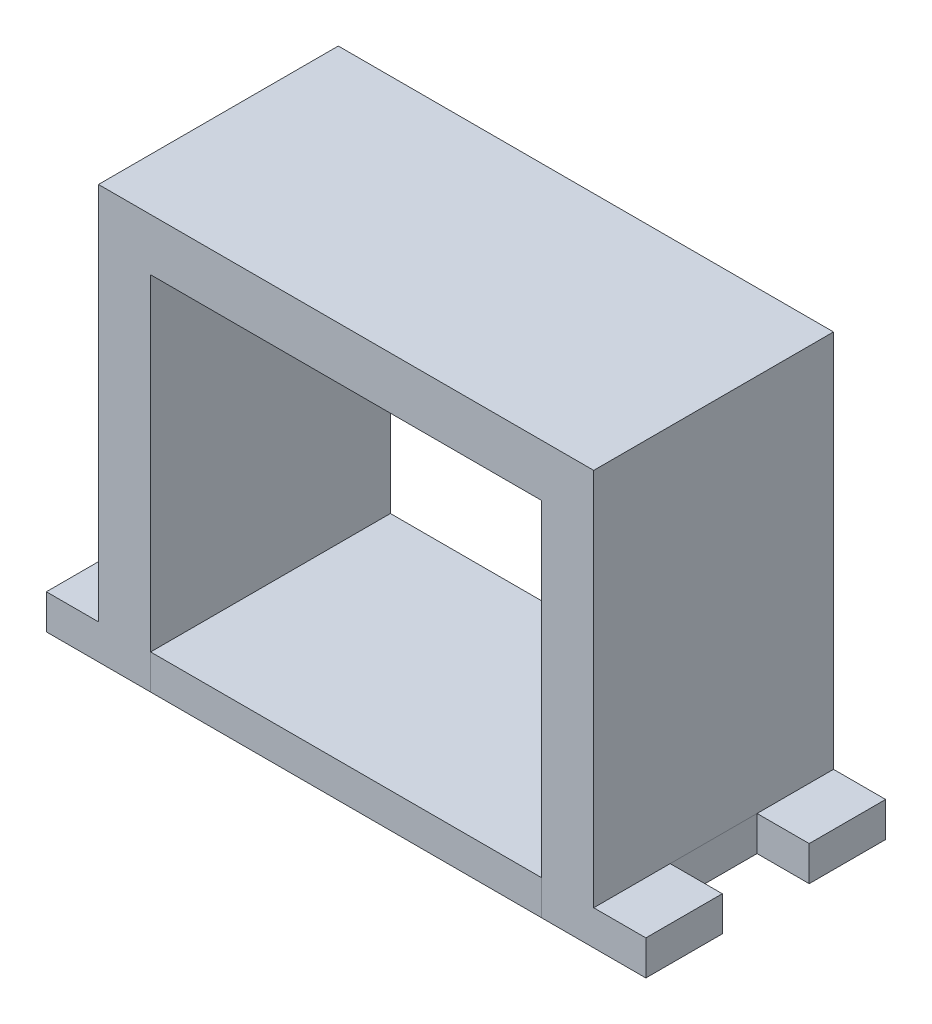
ISO-10303-21;
HEADER;
FILE_DESCRIPTION(('STEP AP214'),'2;1');
FILE_NAME('part.step','',(''),(''),'','','');
FILE_SCHEMA(('AUTOMOTIVE_DESIGN { 1 0 10303 214 1 1 1 1 }'));
ENDSEC;
DATA;
#1=APPLICATION_CONTEXT('core data for automotive mechanical design processes');
#2=APPLICATION_PROTOCOL_DEFINITION('international standard','automotive_design',2000,#1);
#3=PRODUCT_CONTEXT('',#1,'mechanical');
#4=PRODUCT('Part','Part','',(#3));
#5=PRODUCT_RELATED_PRODUCT_CATEGORY('part','',(#4));
#6=PRODUCT_DEFINITION_FORMATION('','',#4);
#7=PRODUCT_DEFINITION_CONTEXT('part definition',#1,'design');
#8=PRODUCT_DEFINITION('design','',#6,#7);
#9=PRODUCT_DEFINITION_SHAPE('','',#8);
#10=(LENGTH_UNIT() NAMED_UNIT(*) SI_UNIT(.MILLI.,.METRE.));
#11=(NAMED_UNIT(*) PLANE_ANGLE_UNIT() SI_UNIT($,.RADIAN.));
#12=(NAMED_UNIT(*) SI_UNIT($,.STERADIAN.) SOLID_ANGLE_UNIT());
#13=UNCERTAINTY_MEASURE_WITH_UNIT(LENGTH_MEASURE(1.E-05),#10,'distance_accuracy_value','');
#14=(GEOMETRIC_REPRESENTATION_CONTEXT(3) GLOBAL_UNCERTAINTY_ASSIGNED_CONTEXT((#13)) GLOBAL_UNIT_ASSIGNED_CONTEXT((#10,
#11,#12)) REPRESENTATION_CONTEXT('',''));
#15=CARTESIAN_POINT('',(0.,0.,0.));
#16=DIRECTION('',(0.,0.,1.));
#17=DIRECTION('',(1.,0.,0.));
#18=AXIS2_PLACEMENT_3D('',#15,#16,#17);
#19=CARTESIAN_POINT('',(0.,-20.8,2.5));
#20=DIRECTION('',(0.,0.,1.));
#21=DIRECTION('',(1.,0.,0.));
#22=AXIS2_PLACEMENT_3D('',#19,#20,#21);
#23=PLANE('',#22);
#24=DIRECTION('',(1.,0.,0.));
#25=VECTOR('',#24,1.);
#26=CARTESIAN_POINT('',(0.,-18.8,2.5));
#27=LINE('',#26,#25);
#28=CARTESIAN_POINT('',(-14.25,-18.8,2.5));
#29=VERTEX_POINT('',#28);
#30=CARTESIAN_POINT('',(-11.25,-18.8,2.5));
#31=VERTEX_POINT('',#30);
#32=EDGE_CURVE('E171',#29,#31,#27,.T.);
#33=ORIENTED_EDGE('',*,*,#32,.F.);
#34=DIRECTION('',(0.,1.,0.));
#35=VECTOR('',#34,1.);
#36=CARTESIAN_POINT('',(-14.25,-20.8,2.5));
#37=LINE('',#36,#35);
#38=CARTESIAN_POINT('',(-14.25,-20.8,2.5));
#39=VERTEX_POINT('',#38);
#40=EDGE_CURVE('E12',#39,#29,#37,.T.);
#41=ORIENTED_EDGE('',*,*,#40,.F.);
#42=DIRECTION('',(1.,0.,0.));
#43=VECTOR('',#42,1.);
#44=CARTESIAN_POINT('',(0.,-20.8,2.5));
#45=LINE('',#44,#43);
#46=CARTESIAN_POINT('',(-11.25,-20.8,2.5));
#47=VERTEX_POINT('',#46);
#48=EDGE_CURVE('E254',#39,#47,#45,.T.);
#49=ORIENTED_EDGE('',*,*,#48,.T.);
#50=DIRECTION('',(0.,1.,0.));
#51=VECTOR('',#50,1.);
#52=CARTESIAN_POINT('',(-11.25,-20.8,2.5));
#53=LINE('',#52,#51);
#54=EDGE_CURVE('E67',#47,#31,#53,.T.);
#55=ORIENTED_EDGE('',*,*,#54,.T.);
#56=EDGE_LOOP('',(#33,#41,#49,#55));
#57=FACE_BOUND('',#56,.T.);
#58=ADVANCED_FACE('F51',(#57),#23,.T.);
#59=CARTESIAN_POINT('',(-14.25,-20.8,0.));
#60=DIRECTION('',(1.,0.,0.));
#61=DIRECTION('',(0.,0.,-1.));
#62=AXIS2_PLACEMENT_3D('',#59,#60,#61);
#63=PLANE('',#62);
#64=DIRECTION('',(0.,0.,-1.));
#65=VECTOR('',#64,1.);
#66=CARTESIAN_POINT('',(-14.25,-18.8,0.));
#67=LINE('',#66,#65);
#68=CARTESIAN_POINT('',(-14.25,-18.8,-2.5));
#69=VERTEX_POINT('',#68);
#70=EDGE_CURVE('E173',#29,#69,#67,.T.);
#71=ORIENTED_EDGE('',*,*,#70,.T.);
#72=DIRECTION('',(0.,1.,0.));
#73=VECTOR('',#72,1.);
#74=CARTESIAN_POINT('',(-14.25,-20.8,-2.5));
#75=LINE('',#74,#73);
#76=CARTESIAN_POINT('',(-14.25,-20.8,-2.5));
#77=VERTEX_POINT('',#76);
#78=EDGE_CURVE('E59',#77,#69,#75,.T.);
#79=ORIENTED_EDGE('',*,*,#78,.F.);
#80=DIRECTION('',(0.,0.,-1.));
#81=VECTOR('',#80,1.);
#82=CARTESIAN_POINT('',(-14.25,-20.8,0.));
#83=LINE('',#82,#81);
#84=EDGE_CURVE('E235',#39,#77,#83,.T.);
#85=ORIENTED_EDGE('',*,*,#84,.F.);
#86=ORIENTED_EDGE('',*,*,#40,.T.);
#87=EDGE_LOOP('',(#71,#79,#85,#86));
#88=FACE_BOUND('',#87,.T.);
#89=ADVANCED_FACE('F256',(#88),#63,.F.);
#90=CARTESIAN_POINT('',(0.,-20.8,-2.5));
#91=DIRECTION('',(0.,0.,1.));
#92=DIRECTION('',(1.,0.,0.));
#93=AXIS2_PLACEMENT_3D('',#90,#91,#92);
#94=PLANE('',#93);
#95=DIRECTION('',(1.,0.,0.));
#96=VECTOR('',#95,1.);
#97=CARTESIAN_POINT('',(0.,-18.8,-2.5));
#98=LINE('',#97,#96);
#99=CARTESIAN_POINT('',(-11.25,-18.8,-2.5));
#100=VERTEX_POINT('',#99);
#101=EDGE_CURVE('E175',#69,#100,#98,.T.);
#102=ORIENTED_EDGE('',*,*,#101,.T.);
#103=DIRECTION('',(0.,1.,0.));
#104=VECTOR('',#103,1.);
#105=CARTESIAN_POINT('',(-11.25,-20.8,-2.5));
#106=LINE('',#105,#104);
#107=CARTESIAN_POINT('',(-11.25,-20.8,-2.5));
#108=VERTEX_POINT('',#107);
#109=EDGE_CURVE('E212',#108,#100,#106,.T.);
#110=ORIENTED_EDGE('',*,*,#109,.F.);
#111=DIRECTION('',(1.,0.,0.));
#112=VECTOR('',#111,1.);
#113=CARTESIAN_POINT('',(0.,-20.8,-2.5));
#114=LINE('',#113,#112);
#115=EDGE_CURVE('E220',#77,#108,#114,.T.);
#116=ORIENTED_EDGE('',*,*,#115,.F.);
#117=ORIENTED_EDGE('',*,*,#78,.T.);
#118=EDGE_LOOP('',(#102,#110,#116,#117));
#119=FACE_BOUND('',#118,.T.);
#120=ADVANCED_FACE('F218',(#119),#94,.F.);
#121=CARTESIAN_POINT('',(-11.25,-20.8,0.));
#122=DIRECTION('',(-1.,0.,0.));
#123=DIRECTION('',(0.,0.,1.));
#124=AXIS2_PLACEMENT_3D('',#121,#122,#123);
#125=PLANE('',#124);
#126=DIRECTION('',(0.,0.,1.));
#127=VECTOR('',#126,1.);
#128=CARTESIAN_POINT('',(-11.25,-18.8,0.));
#129=LINE('',#128,#127);
#130=CARTESIAN_POINT('',(-11.25,-18.8,-6.9));
#131=VERTEX_POINT('',#130);
#132=EDGE_CURVE('E178',#131,#100,#129,.T.);
#133=ORIENTED_EDGE('',*,*,#132,.F.);
#134=DIRECTION('',(0.,1.,0.));
#135=VECTOR('',#134,1.);
#136=CARTESIAN_POINT('',(-11.25,-20.8,-6.9));
#137=LINE('',#136,#135);
#138=CARTESIAN_POINT('',(-11.25,-20.8,-6.9));
#139=VERTEX_POINT('',#138);
#140=EDGE_CURVE('E210',#139,#131,#137,.T.);
#141=ORIENTED_EDGE('',*,*,#140,.F.);
#142=DIRECTION('',(0.,0.,1.));
#143=VECTOR('',#142,1.);
#144=CARTESIAN_POINT('',(-11.25,-20.8,0.));
#145=LINE('',#144,#143);
#146=EDGE_CURVE('E167',#139,#108,#145,.T.);
#147=ORIENTED_EDGE('',*,*,#146,.T.);
#148=ORIENTED_EDGE('',*,*,#109,.T.);
#149=EDGE_LOOP('',(#133,#141,#147,#148));
#150=FACE_BOUND('',#149,.T.);
#151=ADVANCED_FACE('F228',(#150),#125,.T.);
#152=CARTESIAN_POINT('',(0.,-20.8,-6.9));
#153=DIRECTION('',(0.,0.,-1.));
#154=DIRECTION('',(-1.,0.,0.));
#155=AXIS2_PLACEMENT_3D('',#152,#153,#154);
#156=PLANE('',#155);
#157=DIRECTION('',(-1.,0.,0.));
#158=VECTOR('',#157,1.);
#159=CARTESIAN_POINT('',(0.,-18.8,-6.9));
#160=LINE('',#159,#158);
#161=CARTESIAN_POINT('',(11.25,-18.8,-6.9));
#162=VERTEX_POINT('',#161);
#163=EDGE_CURVE('E181',#162,#131,#160,.T.);
#164=ORIENTED_EDGE('',*,*,#163,.F.);
#165=DIRECTION('',(0.,1.,0.));
#166=VECTOR('',#165,1.);
#167=CARTESIAN_POINT('',(11.25,-20.8,-6.9));
#168=LINE('',#167,#166);
#169=CARTESIAN_POINT('',(11.25,-20.8,-6.9));
#170=VERTEX_POINT('',#169);
#171=EDGE_CURVE('E208',#170,#162,#168,.T.);
#172=ORIENTED_EDGE('',*,*,#171,.F.);
#173=DIRECTION('',(-1.,0.,0.));
#174=VECTOR('',#173,1.);
#175=CARTESIAN_POINT('',(0.,-20.8,-6.9));
#176=LINE('',#175,#174);
#177=EDGE_CURVE('E233',#170,#139,#176,.T.);
#178=ORIENTED_EDGE('',*,*,#177,.T.);
#179=ORIENTED_EDGE('',*,*,#140,.T.);
#180=EDGE_LOOP('',(#164,#172,#178,#179));
#181=FACE_BOUND('',#180,.T.);
#182=ADVANCED_FACE('F264',(#181),#156,.T.);
#183=CARTESIAN_POINT('',(11.25,-20.8,0.));
#184=DIRECTION('',(1.,0.,0.));
#185=DIRECTION('',(0.,0.,-1.));
#186=AXIS2_PLACEMENT_3D('',#183,#184,#185);
#187=PLANE('',#186);
#188=DIRECTION('',(0.,0.,-1.));
#189=VECTOR('',#188,1.);
#190=CARTESIAN_POINT('',(11.25,-18.8,0.));
#191=LINE('',#190,#189);
#192=CARTESIAN_POINT('',(11.25,-18.8,-2.49999999999999));
#193=VERTEX_POINT('',#192);
#194=EDGE_CURVE('E185',#193,#162,#191,.T.);
#195=ORIENTED_EDGE('',*,*,#194,.F.);
#196=DIRECTION('',(0.,1.,0.));
#197=VECTOR('',#196,1.);
#198=CARTESIAN_POINT('',(11.25,-20.8,-2.49999999999999));
#199=LINE('',#198,#197);
#200=CARTESIAN_POINT('',(11.25,-20.8,-2.49999999999999));
#201=VERTEX_POINT('',#200);
#202=EDGE_CURVE('E206',#201,#193,#199,.T.);
#203=ORIENTED_EDGE('',*,*,#202,.F.);
#204=DIRECTION('',(0.,0.,-1.));
#205=VECTOR('',#204,1.);
#206=CARTESIAN_POINT('',(11.25,-20.8,0.));
#207=LINE('',#206,#205);
#208=EDGE_CURVE('E162',#201,#170,#207,.T.);
#209=ORIENTED_EDGE('',*,*,#208,.T.);
#210=ORIENTED_EDGE('',*,*,#171,.T.);
#211=EDGE_LOOP('',(#195,#203,#209,#210));
#212=FACE_BOUND('',#211,.T.);
#213=ADVANCED_FACE('F267',(#212),#187,.T.);
#214=CARTESIAN_POINT('',(0.,-20.8,-2.49999999999999));
#215=DIRECTION('',(0.,0.,-1.));
#216=DIRECTION('',(-1.,0.,0.));
#217=AXIS2_PLACEMENT_3D('',#214,#215,#216);
#218=PLANE('',#217);
#219=DIRECTION('',(-1.,0.,0.));
#220=VECTOR('',#219,1.);
#221=CARTESIAN_POINT('',(0.,-18.8,-2.49999999999999));
#222=LINE('',#221,#220);
#223=CARTESIAN_POINT('',(14.25,-18.8,-2.49999999999999));
#224=VERTEX_POINT('',#223);
#225=EDGE_CURVE('E188',#224,#193,#222,.T.);
#226=ORIENTED_EDGE('',*,*,#225,.F.);
#227=DIRECTION('',(0.,1.,0.));
#228=VECTOR('',#227,1.);
#229=CARTESIAN_POINT('',(14.25,-20.8,-2.49999999999999));
#230=LINE('',#229,#228);
#231=CARTESIAN_POINT('',(14.25,-20.8,-2.49999999999999));
#232=VERTEX_POINT('',#231);
#233=EDGE_CURVE('E204',#232,#224,#230,.T.);
#234=ORIENTED_EDGE('',*,*,#233,.F.);
#235=DIRECTION('',(-1.,0.,0.));
#236=VECTOR('',#235,1.);
#237=CARTESIAN_POINT('',(0.,-20.8,-2.49999999999999));
#238=LINE('',#237,#236);
#239=EDGE_CURVE('E240',#232,#201,#238,.T.);
#240=ORIENTED_EDGE('',*,*,#239,.T.);
#241=ORIENTED_EDGE('',*,*,#202,.T.);
#242=EDGE_LOOP('',(#226,#234,#240,#241));
#243=FACE_BOUND('',#242,.T.);
#244=ADVANCED_FACE('F269',(#243),#218,.T.);
#245=CARTESIAN_POINT('',(14.25,-20.8,0.));
#246=DIRECTION('',(-1.,0.,0.));
#247=DIRECTION('',(0.,0.,1.));
#248=AXIS2_PLACEMENT_3D('',#245,#246,#247);
#249=PLANE('',#248);
#250=DIRECTION('',(0.,0.,1.));
#251=VECTOR('',#250,1.);
#252=CARTESIAN_POINT('',(14.25,-18.8,0.));
#253=LINE('',#252,#251);
#254=CARTESIAN_POINT('',(14.25,-18.8,2.5));
#255=VERTEX_POINT('',#254);
#256=EDGE_CURVE('E191',#224,#255,#253,.T.);
#257=ORIENTED_EDGE('',*,*,#256,.T.);
#258=DIRECTION('',(0.,1.,0.));
#259=VECTOR('',#258,1.);
#260=CARTESIAN_POINT('',(14.25,-20.8,2.5));
#261=LINE('',#260,#259);
#262=CARTESIAN_POINT('',(14.25,-20.8,2.5));
#263=VERTEX_POINT('',#262);
#264=EDGE_CURVE('E201',#263,#255,#261,.T.);
#265=ORIENTED_EDGE('',*,*,#264,.F.);
#266=DIRECTION('',(0.,0.,1.));
#267=VECTOR('',#266,1.);
#268=CARTESIAN_POINT('',(14.25,-20.8,0.));
#269=LINE('',#268,#267);
#270=EDGE_CURVE('E242',#232,#263,#269,.T.);
#271=ORIENTED_EDGE('',*,*,#270,.F.);
#272=ORIENTED_EDGE('',*,*,#233,.T.);
#273=EDGE_LOOP('',(#257,#265,#271,#272));
#274=FACE_BOUND('',#273,.T.);
#275=ADVANCED_FACE('F248',(#274),#249,.F.);
#276=CARTESIAN_POINT('',(0.,-20.8,2.5));
#277=DIRECTION('',(0.,0.,-1.));
#278=DIRECTION('',(-1.,0.,0.));
#279=AXIS2_PLACEMENT_3D('',#276,#277,#278);
#280=PLANE('',#279);
#281=DIRECTION('',(-1.,0.,0.));
#282=VECTOR('',#281,1.);
#283=CARTESIAN_POINT('',(0.,-18.8,2.5));
#284=LINE('',#283,#282);
#285=CARTESIAN_POINT('',(11.25,-18.8,2.5));
#286=VERTEX_POINT('',#285);
#287=EDGE_CURVE('E193',#255,#286,#284,.T.);
#288=ORIENTED_EDGE('',*,*,#287,.T.);
#289=DIRECTION('',(0.,1.,0.));
#290=VECTOR('',#289,1.);
#291=CARTESIAN_POINT('',(11.25,-20.8,2.5));
#292=LINE('',#291,#290);
#293=CARTESIAN_POINT('',(11.25,-20.8,2.5));
#294=VERTEX_POINT('',#293);
#295=EDGE_CURVE('E150',#294,#286,#292,.T.);
#296=ORIENTED_EDGE('',*,*,#295,.F.);
#297=DIRECTION('',(-1.,0.,0.));
#298=VECTOR('',#297,1.);
#299=CARTESIAN_POINT('',(0.,-20.8,2.5));
#300=LINE('',#299,#298);
#301=EDGE_CURVE('E159',#263,#294,#300,.T.);
#302=ORIENTED_EDGE('',*,*,#301,.F.);
#303=ORIENTED_EDGE('',*,*,#264,.T.);
#304=EDGE_LOOP('',(#288,#296,#302,#303));
#305=FACE_BOUND('',#304,.T.);
#306=ADVANCED_FACE('F252',(#305),#280,.F.);
#307=CARTESIAN_POINT('',(11.25,-18.8,6.9));
#308=VERTEX_POINT('',#307);
#309=EDGE_CURVE('E146',#308,#286,#191,.T.);
#310=ORIENTED_EDGE('',*,*,#309,.F.);
#311=DIRECTION('',(0.,1.,0.));
#312=VECTOR('',#311,1.);
#313=CARTESIAN_POINT('',(11.25,-20.8,6.9));
#314=LINE('',#313,#312);
#315=CARTESIAN_POINT('',(11.25,-20.8,6.9));
#316=VERTEX_POINT('',#315);
#317=EDGE_CURVE('E141',#316,#308,#314,.T.);
#318=ORIENTED_EDGE('',*,*,#317,.F.);
#319=EDGE_CURVE('E144',#316,#294,#207,.T.);
#320=ORIENTED_EDGE('',*,*,#319,.T.);
#321=ORIENTED_EDGE('',*,*,#295,.T.);
#322=EDGE_LOOP('',(#310,#318,#320,#321));
#323=FACE_BOUND('',#322,.T.);
#324=ADVANCED_FACE('F143',(#323),#187,.T.);
#325=CARTESIAN_POINT('',(0.,-20.8,6.9));
#326=DIRECTION('',(0.,0.,1.));
#327=DIRECTION('',(1.,0.,0.));
#328=AXIS2_PLACEMENT_3D('',#325,#326,#327);
#329=PLANE('',#328);
#330=DIRECTION('',(1.,0.,0.));
#331=VECTOR('',#330,1.);
#332=CARTESIAN_POINT('',(0.,-18.8,6.9));
#333=LINE('',#332,#331);
#334=CARTESIAN_POINT('',(-11.25,-18.8,6.9));
#335=VERTEX_POINT('',#334);
#336=EDGE_CURVE('E196',#335,#308,#333,.T.);
#337=ORIENTED_EDGE('',*,*,#336,.F.);
#338=DIRECTION('',(0.,1.,0.));
#339=VECTOR('',#338,1.);
#340=CARTESIAN_POINT('',(-11.25,-20.8,6.9));
#341=LINE('',#340,#339);
#342=CARTESIAN_POINT('',(-11.25,-20.8,6.9));
#343=VERTEX_POINT('',#342);
#344=EDGE_CURVE('E104',#343,#335,#341,.T.);
#345=ORIENTED_EDGE('',*,*,#344,.F.);
#346=DIRECTION('',(1.,0.,0.));
#347=VECTOR('',#346,1.);
#348=CARTESIAN_POINT('',(0.,-20.8,6.9));
#349=LINE('',#348,#347);
#350=EDGE_CURVE('E157',#343,#316,#349,.T.);
#351=ORIENTED_EDGE('',*,*,#350,.T.);
#352=ORIENTED_EDGE('',*,*,#317,.T.);
#353=EDGE_LOOP('',(#337,#345,#351,#352));
#354=FACE_BOUND('',#353,.T.);
#355=ADVANCED_FACE('F163',(#354),#329,.T.);
#356=EDGE_CURVE('E182',#31,#335,#129,.T.);
#357=ORIENTED_EDGE('',*,*,#356,.F.);
#358=ORIENTED_EDGE('',*,*,#54,.F.);
#359=EDGE_CURVE('E164',#47,#343,#145,.T.);
#360=ORIENTED_EDGE('',*,*,#359,.T.);
#361=ORIENTED_EDGE('',*,*,#344,.T.);
#362=EDGE_LOOP('',(#357,#358,#360,#361));
#363=FACE_BOUND('',#362,.T.);
#364=ADVANCED_FACE('F281',(#363),#125,.T.);
#365=CARTESIAN_POINT('',(0.,-20.8,0.));
#366=DIRECTION('',(0.,-1.,0.));
#367=DIRECTION('',(0.,0.,-1.));
#368=AXIS2_PLACEMENT_3D('',#365,#366,#367);
#369=PLANE('',#368);
#370=ORIENTED_EDGE('',*,*,#48,.F.);
#371=ORIENTED_EDGE('',*,*,#84,.T.);
#372=ORIENTED_EDGE('',*,*,#115,.T.);
#373=ORIENTED_EDGE('',*,*,#146,.F.);
#374=ORIENTED_EDGE('',*,*,#177,.F.);
#375=ORIENTED_EDGE('',*,*,#208,.F.);
#376=ORIENTED_EDGE('',*,*,#239,.F.);
#377=ORIENTED_EDGE('',*,*,#270,.T.);
#378=ORIENTED_EDGE('',*,*,#301,.T.);
#379=ORIENTED_EDGE('',*,*,#319,.F.);
#380=ORIENTED_EDGE('',*,*,#350,.F.);
#381=ORIENTED_EDGE('',*,*,#359,.F.);
#382=EDGE_LOOP('',(#370,#371,#372,#373,#374,#375,#376,#377,#378,#379,#380,#381));
#383=FACE_BOUND('',#382,.T.);
#384=ADVANCED_FACE('F155',(#383),#369,.T.);
#385=CARTESIAN_POINT('',(0.,-18.8,0.));
#386=DIRECTION('',(0.,-1.,0.));
#387=DIRECTION('',(0.,0.,-1.));
#388=AXIS2_PLACEMENT_3D('',#385,#386,#387);
#389=PLANE('',#388);
#390=ORIENTED_EDGE('',*,*,#32,.T.);
#391=ORIENTED_EDGE('',*,*,#356,.T.);
#392=ORIENTED_EDGE('',*,*,#336,.T.);
#393=ORIENTED_EDGE('',*,*,#309,.T.);
#394=ORIENTED_EDGE('',*,*,#287,.F.);
#395=ORIENTED_EDGE('',*,*,#256,.F.);
#396=ORIENTED_EDGE('',*,*,#225,.T.);
#397=ORIENTED_EDGE('',*,*,#194,.T.);
#398=ORIENTED_EDGE('',*,*,#163,.T.);
#399=ORIENTED_EDGE('',*,*,#132,.T.);
#400=ORIENTED_EDGE('',*,*,#101,.F.);
#401=ORIENTED_EDGE('',*,*,#70,.F.);
#402=EDGE_LOOP('',(#390,#391,#392,#393,#394,#395,#396,#397,#398,#399,#400,#401));
#403=FACE_BOUND('',#402,.T.);
#404=ADVANCED_FACE('F224',(#403),#389,.F.);
#405=CLOSED_SHELL('',(#58,#89,#120,#151,#182,#213,#244,#275,#306,#324,#355,#364,#384,#404));
#406=MANIFOLD_SOLID_BREP('B2',#405);
#407=CARTESIAN_POINT('',(14.25,3.,0.));
#408=DIRECTION('',(-1.,0.,0.));
#409=DIRECTION('',(0.,0.,1.));
#410=AXIS2_PLACEMENT_3D('',#407,#408,#409);
#411=PLANE('',#410);
#412=DIRECTION('',(0.,0.,-1.));
#413=VECTOR('',#412,1.);
#414=CARTESIAN_POINT('',(14.25,-18.8,0.));
#415=LINE('',#414,#413);
#416=CARTESIAN_POINT('',(14.25,-18.8,-2.49999999999999));
#417=VERTEX_POINT('',#416);
#418=CARTESIAN_POINT('',(14.25,-18.8,-6.9));
#419=VERTEX_POINT('',#418);
#420=EDGE_CURVE('E440',#417,#419,#415,.T.);
#421=ORIENTED_EDGE('',*,*,#420,.T.);
#422=DIRECTION('',(0.,-1.,0.));
#423=VECTOR('',#422,1.);
#424=CARTESIAN_POINT('',(14.25,3.,-6.9));
#425=LINE('',#424,#423);
#426=CARTESIAN_POINT('',(14.25,3.,-6.9));
#427=VERTEX_POINT('',#426);
#428=EDGE_CURVE('E753',#427,#419,#425,.T.);
#429=ORIENTED_EDGE('',*,*,#428,.F.);
#430=DIRECTION('',(0.,0.,-1.));
#431=VECTOR('',#430,1.);
#432=CARTESIAN_POINT('',(14.25,3.,0.));
#433=LINE('',#432,#431);
#434=CARTESIAN_POINT('',(14.25,3.,6.9));
#435=VERTEX_POINT('',#434);
#436=EDGE_CURVE('E751',#435,#427,#433,.T.);
#437=ORIENTED_EDGE('',*,*,#436,.F.);
#438=DIRECTION('',(0.,-1.,0.));
#439=VECTOR('',#438,1.);
#440=CARTESIAN_POINT('',(14.25,3.,6.9));
#441=LINE('',#440,#439);
#442=CARTESIAN_POINT('',(14.25,-18.8,6.9));
#443=VERTEX_POINT('',#442);
#444=EDGE_CURVE('E759',#435,#443,#441,.T.);
#445=ORIENTED_EDGE('',*,*,#444,.T.);
#446=DIRECTION('',(0.,0.,-1.));
#447=VECTOR('',#446,1.);
#448=CARTESIAN_POINT('',(14.25,-18.8,0.));
#449=LINE('',#448,#447);
#450=CARTESIAN_POINT('',(14.25,-18.8,2.5));
#451=VERTEX_POINT('',#450);
#452=EDGE_CURVE('E595',#443,#451,#449,.T.);
#453=ORIENTED_EDGE('',*,*,#452,.T.);
#454=DIRECTION('',(0.,0.,-1.));
#455=VECTOR('',#454,1.);
#456=CARTESIAN_POINT('',(14.25,-18.8,0.));
#457=LINE('',#456,#455);
#458=EDGE_CURVE('E713',#451,#417,#457,.T.);
#459=ORIENTED_EDGE('',*,*,#458,.T.);
#460=EDGE_LOOP('',(#421,#429,#437,#445,#453,#459));
#461=FACE_BOUND('',#460,.T.);
#462=ADVANCED_FACE('F425',(#461),#411,.F.);
#463=CARTESIAN_POINT('',(-14.25,3.,0.));
#464=DIRECTION('',(-1.,0.,0.));
#465=DIRECTION('',(0.,0.,1.));
#466=AXIS2_PLACEMENT_3D('',#463,#464,#465);
#467=PLANE('',#466);
#468=DIRECTION('',(0.,-1.,0.));
#469=VECTOR('',#468,1.);
#470=CARTESIAN_POINT('',(-14.25,3.,-6.9));
#471=LINE('',#470,#469);
#472=CARTESIAN_POINT('',(-14.25,3.,-6.9));
#473=VERTEX_POINT('',#472);
#474=CARTESIAN_POINT('',(-14.25,-18.8,-6.9));
#475=VERTEX_POINT('',#474);
#476=EDGE_CURVE('E49',#473,#475,#471,.T.);
#477=ORIENTED_EDGE('',*,*,#476,.T.);
#478=DIRECTION('',(0.,0.,-1.));
#479=VECTOR('',#478,1.);
#480=CARTESIAN_POINT('',(-14.25,-18.8,0.));
#481=LINE('',#480,#479);
#482=CARTESIAN_POINT('',(-14.25,-18.8,-2.5));
#483=VERTEX_POINT('',#482);
#484=EDGE_CURVE('E628',#483,#475,#481,.T.);
#485=ORIENTED_EDGE('',*,*,#484,.F.);
#486=DIRECTION('',(0.,0.,-1.));
#487=VECTOR('',#486,1.);
#488=CARTESIAN_POINT('',(-14.25,-18.8,0.));
#489=LINE('',#488,#487);
#490=CARTESIAN_POINT('',(-14.25,-18.8,2.5));
#491=VERTEX_POINT('',#490);
#492=EDGE_CURVE('E724',#491,#483,#489,.T.);
#493=ORIENTED_EDGE('',*,*,#492,.F.);
#494=DIRECTION('',(0.,0.,-1.));
#495=VECTOR('',#494,1.);
#496=CARTESIAN_POINT('',(-14.25,-18.8,0.));
#497=LINE('',#496,#495);
#498=CARTESIAN_POINT('',(-14.25,-18.8,6.9));
#499=VERTEX_POINT('',#498);
#500=EDGE_CURVE('E448',#499,#491,#497,.T.);
#501=ORIENTED_EDGE('',*,*,#500,.F.);
#502=DIRECTION('',(0.,-1.,0.));
#503=VECTOR('',#502,1.);
#504=CARTESIAN_POINT('',(-14.25,3.,6.9));
#505=LINE('',#504,#503);
#506=CARTESIAN_POINT('',(-14.25,3.,6.9));
#507=VERTEX_POINT('',#506);
#508=EDGE_CURVE('E433',#507,#499,#505,.T.);
#509=ORIENTED_EDGE('',*,*,#508,.F.);
#510=DIRECTION('',(0.,0.,-1.));
#511=VECTOR('',#510,1.);
#512=CARTESIAN_POINT('',(-14.25,3.,0.));
#513=LINE('',#512,#511);
#514=EDGE_CURVE('E745',#507,#473,#513,.T.);
#515=ORIENTED_EDGE('',*,*,#514,.T.);
#516=EDGE_LOOP('',(#477,#485,#493,#501,#509,#515));
#517=FACE_BOUND('',#516,.T.);
#518=ADVANCED_FACE('F807',(#517),#467,.T.);
#519=CARTESIAN_POINT('',(0.,-18.8,0.));
#520=DIRECTION('',(0.,1.,0.));
#521=DIRECTION('',(0.,0.,1.));
#522=AXIS2_PLACEMENT_3D('',#519,#520,#521);
#523=PLANE('',#522);
#524=DIRECTION('',(-1.,0.,0.));
#525=VECTOR('',#524,1.);
#526=CARTESIAN_POINT('',(0.,-18.8,-2.49999999999999));
#527=LINE('',#526,#525);
#528=CARTESIAN_POINT('',(11.25,-18.8,-2.49999999999999));
#529=VERTEX_POINT('',#528);
#530=EDGE_CURVE('E663',#417,#529,#527,.T.);
#531=ORIENTED_EDGE('',*,*,#530,.F.);
#532=ORIENTED_EDGE('',*,*,#458,.F.);
#533=DIRECTION('',(-1.,0.,0.));
#534=VECTOR('',#533,1.);
#535=CARTESIAN_POINT('',(0.,-18.8,2.5));
#536=LINE('',#535,#534);
#537=CARTESIAN_POINT('',(11.25,-18.8,2.5));
#538=VERTEX_POINT('',#537);
#539=EDGE_CURVE('E670',#451,#538,#536,.T.);
#540=ORIENTED_EDGE('',*,*,#539,.T.);
#541=DIRECTION('',(0.,0.,1.));
#542=VECTOR('',#541,1.);
#543=CARTESIAN_POINT('',(11.25,-18.8,0.));
#544=LINE('',#543,#542);
#545=EDGE_CURVE('E711',#529,#538,#544,.T.);
#546=ORIENTED_EDGE('',*,*,#545,.F.);
#547=EDGE_LOOP('',(#531,#532,#540,#546));
#548=FACE_BOUND('',#547,.T.);
#549=ADVANCED_FACE('F844',(#548),#523,.F.);
#550=CARTESIAN_POINT('',(0.,-18.8,0.));
#551=DIRECTION('',(0.,1.,0.));
#552=DIRECTION('',(0.,0.,1.));
#553=AXIS2_PLACEMENT_3D('',#550,#551,#552);
#554=PLANE('',#553);
#555=ORIENTED_EDGE('',*,*,#492,.T.);
#556=DIRECTION('',(1.,0.,0.));
#557=VECTOR('',#556,1.);
#558=CARTESIAN_POINT('',(0.,-18.8,-2.5));
#559=LINE('',#558,#557);
#560=CARTESIAN_POINT('',(-11.25,-18.8,-2.5));
#561=VERTEX_POINT('',#560);
#562=EDGE_CURVE('E683',#483,#561,#559,.T.);
#563=ORIENTED_EDGE('',*,*,#562,.T.);
#564=DIRECTION('',(0.,0.,1.));
#565=VECTOR('',#564,1.);
#566=CARTESIAN_POINT('',(-11.25,-18.8,0.));
#567=LINE('',#566,#565);
#568=CARTESIAN_POINT('',(-11.25,-18.8,2.5));
#569=VERTEX_POINT('',#568);
#570=EDGE_CURVE('E722',#561,#569,#567,.T.);
#571=ORIENTED_EDGE('',*,*,#570,.T.);
#572=DIRECTION('',(1.,0.,0.));
#573=VECTOR('',#572,1.);
#574=CARTESIAN_POINT('',(0.,-18.8,2.5));
#575=LINE('',#574,#573);
#576=EDGE_CURVE('E697',#491,#569,#575,.T.);
#577=ORIENTED_EDGE('',*,*,#576,.F.);
#578=EDGE_LOOP('',(#555,#563,#571,#577));
#579=FACE_BOUND('',#578,.T.);
#580=ADVANCED_FACE('F826',(#579),#554,.F.);
#581=CARTESIAN_POINT('',(0.,0.,0.));
#582=DIRECTION('',(0.,1.,0.));
#583=DIRECTION('',(0.,0.,1.));
#584=AXIS2_PLACEMENT_3D('',#581,#582,#583);
#585=PLANE('',#584);
#586=CARTESIAN_POINT('',(0.,0.,0.));
#587=DIRECTION('',(0.,1.,0.));
#588=DIRECTION('',(0.,0.,1.));
#589=AXIS2_PLACEMENT_3D('',#586,#587,#588);
#590=CIRCLE('',#589,1.9);
#591=CARTESIAN_POINT('',(0.,0.,1.9));
#592=VERTEX_POINT('',#591);
#593=EDGE_CURVE('E733',#592,#592,#590,.T.);
#594=ORIENTED_EDGE('',*,*,#593,.T.);
#595=EDGE_LOOP('',(#594));
#596=FACE_BOUND('',#595,.T.);
#597=DIRECTION('',(1.,0.,0.));
#598=VECTOR('',#597,1.);
#599=CARTESIAN_POINT('',(0.,0.,-6.9));
#600=LINE('',#599,#598);
#601=CARTESIAN_POINT('',(-11.25,0.,-6.9));
#602=VERTEX_POINT('',#601);
#603=CARTESIAN_POINT('',(11.25,0.,-6.9));
#604=VERTEX_POINT('',#603);
#605=EDGE_CURVE('E739',#602,#604,#600,.T.);
#606=ORIENTED_EDGE('',*,*,#605,.T.);
#607=DIRECTION('',(0.,0.,1.));
#608=VECTOR('',#607,1.);
#609=CARTESIAN_POINT('',(11.25,0.,0.));
#610=LINE('',#609,#608);
#611=CARTESIAN_POINT('',(11.25,0.,6.9));
#612=VERTEX_POINT('',#611);
#613=EDGE_CURVE('E710',#604,#612,#610,.T.);
#614=ORIENTED_EDGE('',*,*,#613,.T.);
#615=DIRECTION('',(1.,0.,0.));
#616=VECTOR('',#615,1.);
#617=CARTESIAN_POINT('',(0.,0.,6.9));
#618=LINE('',#617,#616);
#619=CARTESIAN_POINT('',(-11.25,0.,6.9));
#620=VERTEX_POINT('',#619);
#621=EDGE_CURVE('E746',#620,#612,#618,.T.);
#622=ORIENTED_EDGE('',*,*,#621,.F.);
#623=DIRECTION('',(0.,0.,1.));
#624=VECTOR('',#623,1.);
#625=CARTESIAN_POINT('',(-11.25,0.,0.));
#626=LINE('',#625,#624);
#627=EDGE_CURVE('E720',#602,#620,#626,.T.);
#628=ORIENTED_EDGE('',*,*,#627,.F.);
#629=EDGE_LOOP('',(#606,#614,#622,#628));
#630=FACE_BOUND('',#629,.T.);
#631=ADVANCED_FACE('F785',(#596,#630),#585,.F.);
#632=CARTESIAN_POINT('',(0.,3.,-6.9));
#633=DIRECTION('',(0.,0.,-1.));
#634=DIRECTION('',(-1.,0.,0.));
#635=AXIS2_PLACEMENT_3D('',#632,#633,#634);
#636=PLANE('',#635);
#637=ORIENTED_EDGE('',*,*,#605,.F.);
#638=DIRECTION('',(0.,1.,0.));
#639=VECTOR('',#638,1.);
#640=CARTESIAN_POINT('',(-11.25,-18.8,-6.9));
#641=LINE('',#640,#639);
#642=CARTESIAN_POINT('',(-11.25,-20.8,-6.9));
#643=VERTEX_POINT('',#642);
#644=EDGE_CURVE('E727',#643,#602,#641,.T.);
#645=ORIENTED_EDGE('',*,*,#644,.F.);
#646=DIRECTION('',(1.,0.,0.));
#647=VECTOR('',#646,1.);
#648=CARTESIAN_POINT('',(0.,-20.8,-6.9));
#649=LINE('',#648,#647);
#650=CARTESIAN_POINT('',(-17.25,-20.8,-6.9));
#651=VERTEX_POINT('',#650);
#652=EDGE_CURVE('E687',#651,#643,#649,.T.);
#653=ORIENTED_EDGE('',*,*,#652,.F.);
#654=DIRECTION('',(0.,1.,0.));
#655=VECTOR('',#654,1.);
#656=CARTESIAN_POINT('',(-17.25,-20.8,-6.9));
#657=LINE('',#656,#655);
#658=CARTESIAN_POINT('',(-17.25,-18.8,-6.9));
#659=VERTEX_POINT('',#658);
#660=EDGE_CURVE('E632',#651,#659,#657,.T.);
#661=ORIENTED_EDGE('',*,*,#660,.T.);
#662=DIRECTION('',(-1.,0.,0.));
#663=VECTOR('',#662,1.);
#664=CARTESIAN_POINT('',(0.,-18.8,-6.89999999999999));
#665=LINE('',#664,#663);
#666=EDGE_CURVE('E633',#475,#659,#665,.T.);
#667=ORIENTED_EDGE('',*,*,#666,.F.);
#668=ORIENTED_EDGE('',*,*,#476,.F.);
#669=DIRECTION('',(1.,0.,0.));
#670=VECTOR('',#669,1.);
#671=CARTESIAN_POINT('',(0.,3.,-6.9));
#672=LINE('',#671,#670);
#673=EDGE_CURVE('E742',#473,#427,#672,.T.);
#674=ORIENTED_EDGE('',*,*,#673,.T.);
#675=ORIENTED_EDGE('',*,*,#428,.T.);
#676=DIRECTION('',(1.,0.,0.));
#677=VECTOR('',#676,1.);
#678=CARTESIAN_POINT('',(0.,-18.8,-6.90000000000003));
#679=LINE('',#678,#677);
#680=CARTESIAN_POINT('',(17.25,-18.8,-6.9));
#681=VERTEX_POINT('',#680);
#682=EDGE_CURVE('E591',#419,#681,#679,.T.);
#683=ORIENTED_EDGE('',*,*,#682,.T.);
#684=DIRECTION('',(0.,1.,0.));
#685=VECTOR('',#684,1.);
#686=CARTESIAN_POINT('',(17.25,-20.8,-6.9));
#687=LINE('',#686,#685);
#688=CARTESIAN_POINT('',(17.25,-20.8,-6.9));
#689=VERTEX_POINT('',#688);
#690=EDGE_CURVE('E588',#689,#681,#687,.T.);
#691=ORIENTED_EDGE('',*,*,#690,.F.);
#692=DIRECTION('',(-1.,0.,0.));
#693=VECTOR('',#692,1.);
#694=CARTESIAN_POINT('',(0.,-20.8,-6.9));
#695=LINE('',#694,#693);
#696=CARTESIAN_POINT('',(11.25,-20.8,-6.9));
#697=VERTEX_POINT('',#696);
#698=EDGE_CURVE('E577',#689,#697,#695,.T.);
#699=ORIENTED_EDGE('',*,*,#698,.T.);
#700=DIRECTION('',(0.,1.,0.));
#701=VECTOR('',#700,1.);
#702=CARTESIAN_POINT('',(11.25,-18.8,-6.9));
#703=LINE('',#702,#701);
#704=EDGE_CURVE('E715',#697,#604,#703,.T.);
#705=ORIENTED_EDGE('',*,*,#704,.T.);
#706=EDGE_LOOP('',(#637,#645,#653,#661,#667,#668,#674,#675,#683,#691,#699,#705));
#707=FACE_BOUND('',#706,.T.);
#708=ADVANCED_FACE('F427',(#707),#636,.T.);
#709=CARTESIAN_POINT('',(0.,3.,6.9));
#710=DIRECTION('',(0.,0.,-1.));
#711=DIRECTION('',(-1.,0.,0.));
#712=AXIS2_PLACEMENT_3D('',#709,#710,#711);
#713=PLANE('',#712);
#714=ORIENTED_EDGE('',*,*,#508,.T.);
#715=DIRECTION('',(-1.,0.,0.));
#716=VECTOR('',#715,1.);
#717=CARTESIAN_POINT('',(0.,-18.8,6.90000000000002));
#718=LINE('',#717,#716);
#719=CARTESIAN_POINT('',(-17.25,-18.8,6.9));
#720=VERTEX_POINT('',#719);
#721=EDGE_CURVE('E655',#499,#720,#718,.T.);
#722=ORIENTED_EDGE('',*,*,#721,.T.);
#723=DIRECTION('',(0.,1.,0.));
#724=VECTOR('',#723,1.);
#725=CARTESIAN_POINT('',(-17.25,-20.8,6.9));
#726=LINE('',#725,#724);
#727=CARTESIAN_POINT('',(-17.25,-20.8,6.9));
#728=VERTEX_POINT('',#727);
#729=EDGE_CURVE('E660',#728,#720,#726,.T.);
#730=ORIENTED_EDGE('',*,*,#729,.F.);
#731=DIRECTION('',(-1.,0.,0.));
#732=VECTOR('',#731,1.);
#733=CARTESIAN_POINT('',(0.,-20.8,6.9));
#734=LINE('',#733,#732);
#735=CARTESIAN_POINT('',(-11.25,-20.8,6.9));
#736=VERTEX_POINT('',#735);
#737=EDGE_CURVE('E703',#736,#728,#734,.T.);
#738=ORIENTED_EDGE('',*,*,#737,.F.);
#739=DIRECTION('',(0.,1.,0.));
#740=VECTOR('',#739,1.);
#741=CARTESIAN_POINT('',(-11.25,-18.8,6.9));
#742=LINE('',#741,#740);
#743=EDGE_CURVE('E730',#736,#620,#742,.T.);
#744=ORIENTED_EDGE('',*,*,#743,.T.);
#745=ORIENTED_EDGE('',*,*,#621,.T.);
#746=DIRECTION('',(0.,1.,0.));
#747=VECTOR('',#746,1.);
#748=CARTESIAN_POINT('',(11.25,-18.8,6.9));
#749=LINE('',#748,#747);
#750=CARTESIAN_POINT('',(11.25,-20.8,6.9));
#751=VERTEX_POINT('',#750);
#752=EDGE_CURVE('E718',#751,#612,#749,.T.);
#753=ORIENTED_EDGE('',*,*,#752,.F.);
#754=DIRECTION('',(1.,0.,0.));
#755=VECTOR('',#754,1.);
#756=CARTESIAN_POINT('',(0.,-20.8,6.9));
#757=LINE('',#756,#755);
#758=CARTESIAN_POINT('',(17.25,-20.8,6.9));
#759=VERTEX_POINT('',#758);
#760=EDGE_CURVE('E671',#751,#759,#757,.T.);
#761=ORIENTED_EDGE('',*,*,#760,.T.);
#762=DIRECTION('',(0.,1.,0.));
#763=VECTOR('',#762,1.);
#764=CARTESIAN_POINT('',(17.25,-20.8,6.9));
#765=LINE('',#764,#763);
#766=CARTESIAN_POINT('',(17.25,-18.8,6.9));
#767=VERTEX_POINT('',#766);
#768=EDGE_CURVE('E613',#759,#767,#765,.T.);
#769=ORIENTED_EDGE('',*,*,#768,.T.);
#770=DIRECTION('',(1.,0.,0.));
#771=VECTOR('',#770,1.);
#772=CARTESIAN_POINT('',(0.,-18.8,6.90000000000002));
#773=LINE('',#772,#771);
#774=EDGE_CURVE('E614',#443,#767,#773,.T.);
#775=ORIENTED_EDGE('',*,*,#774,.F.);
#776=ORIENTED_EDGE('',*,*,#444,.F.);
#777=DIRECTION('',(1.,0.,0.));
#778=VECTOR('',#777,1.);
#779=CARTESIAN_POINT('',(0.,3.,6.9));
#780=LINE('',#779,#778);
#781=EDGE_CURVE('E749',#507,#435,#780,.T.);
#782=ORIENTED_EDGE('',*,*,#781,.F.);
#783=EDGE_LOOP('',(#714,#722,#730,#738,#744,#745,#753,#761,#769,#775,#776,#782));
#784=FACE_BOUND('',#783,.T.);
#785=ADVANCED_FACE('F764',(#784),#713,.F.);
#786=CARTESIAN_POINT('',(0.,3.,0.));
#787=DIRECTION('',(0.,1.,0.));
#788=DIRECTION('',(0.,0.,1.));
#789=AXIS2_PLACEMENT_3D('',#786,#787,#788);
#790=PLANE('',#789);
#791=ORIENTED_EDGE('',*,*,#673,.F.);
#792=ORIENTED_EDGE('',*,*,#514,.F.);
#793=ORIENTED_EDGE('',*,*,#781,.T.);
#794=ORIENTED_EDGE('',*,*,#436,.T.);
#795=EDGE_LOOP('',(#791,#792,#793,#794));
#796=FACE_BOUND('',#795,.T.);
#797=ADVANCED_FACE('F806',(#796),#790,.T.);
#798=CARTESIAN_POINT('',(0.,2.,0.));
#799=DIRECTION('',(0.,-1.,0.));
#800=DIRECTION('',(0.,0.,-1.));
#801=AXIS2_PLACEMENT_3D('',#798,#799,#800);
#802=CYLINDRICAL_SURFACE('',#801,1.9);
#803=CARTESIAN_POINT('',(0.,2.,0.));
#804=DIRECTION('',(0.,1.,0.));
#805=DIRECTION('',(0.,0.,1.));
#806=AXIS2_PLACEMENT_3D('',#803,#804,#805);
#807=CIRCLE('',#806,1.9);
#808=CARTESIAN_POINT('',(0.,2.,1.9));
#809=VERTEX_POINT('',#808);
#810=EDGE_CURVE('E736',#809,#809,#807,.T.);
#811=ORIENTED_EDGE('',*,*,#810,.T.);
#812=EDGE_LOOP('',(#811));
#813=FACE_BOUND('',#812,.T.);
#814=ORIENTED_EDGE('',*,*,#593,.F.);
#815=EDGE_LOOP('',(#814));
#816=FACE_BOUND('',#815,.T.);
#817=ADVANCED_FACE('F852',(#813,#816),#802,.F.);
#818=CARTESIAN_POINT('',(0.,2.,0.));
#819=DIRECTION('',(0.,1.,0.));
#820=DIRECTION('',(0.,0.,1.));
#821=AXIS2_PLACEMENT_3D('',#818,#819,#820);
#822=PLANE('',#821);
#823=ORIENTED_EDGE('',*,*,#810,.F.);
#824=EDGE_LOOP('',(#823));
#825=FACE_BOUND('',#824,.T.);
#826=ADVANCED_FACE('F866',(#825),#822,.F.);
#827=CARTESIAN_POINT('',(-11.25,-18.8,0.));
#828=DIRECTION('',(-1.,0.,0.));
#829=DIRECTION('',(0.,0.,1.));
#830=AXIS2_PLACEMENT_3D('',#827,#828,#829);
#831=PLANE('',#830);
#832=ORIENTED_EDGE('',*,*,#627,.T.);
#833=ORIENTED_EDGE('',*,*,#743,.F.);
#834=DIRECTION('',(0.,0.,1.));
#835=VECTOR('',#834,1.);
#836=CARTESIAN_POINT('',(-11.25,-20.8,0.));
#837=LINE('',#836,#835);
#838=CARTESIAN_POINT('',(-11.25,-20.8,2.5));
#839=VERTEX_POINT('',#838);
#840=EDGE_CURVE('E700',#839,#736,#837,.T.);
#841=ORIENTED_EDGE('',*,*,#840,.F.);
#842=DIRECTION('',(0.,1.,0.));
#843=VECTOR('',#842,1.);
#844=CARTESIAN_POINT('',(-11.25,-20.8,2.5));
#845=LINE('',#844,#843);
#846=EDGE_CURVE('E705',#839,#569,#845,.T.);
#847=ORIENTED_EDGE('',*,*,#846,.T.);
#848=ORIENTED_EDGE('',*,*,#570,.F.);
#849=DIRECTION('',(0.,1.,0.));
#850=VECTOR('',#849,1.);
#851=CARTESIAN_POINT('',(-11.25,-20.8,-2.5));
#852=LINE('',#851,#850);
#853=CARTESIAN_POINT('',(-11.25,-20.8,-2.5));
#854=VERTEX_POINT('',#853);
#855=EDGE_CURVE('E692',#854,#561,#852,.T.);
#856=ORIENTED_EDGE('',*,*,#855,.F.);
#857=DIRECTION('',(0.,0.,1.));
#858=VECTOR('',#857,1.);
#859=CARTESIAN_POINT('',(-11.25,-20.8,0.));
#860=LINE('',#859,#858);
#861=EDGE_CURVE('E690',#643,#854,#860,.T.);
#862=ORIENTED_EDGE('',*,*,#861,.F.);
#863=ORIENTED_EDGE('',*,*,#644,.T.);
#864=EDGE_LOOP('',(#832,#833,#841,#847,#848,#856,#862,#863));
#865=FACE_BOUND('',#864,.T.);
#866=ADVANCED_FACE('F782',(#865),#831,.F.);
#867=CARTESIAN_POINT('',(11.25,-18.8,0.));
#868=DIRECTION('',(-1.,0.,0.));
#869=DIRECTION('',(0.,0.,1.));
#870=AXIS2_PLACEMENT_3D('',#867,#868,#869);
#871=PLANE('',#870);
#872=ORIENTED_EDGE('',*,*,#613,.F.);
#873=ORIENTED_EDGE('',*,*,#704,.F.);
#874=DIRECTION('',(0.,0.,-1.));
#875=VECTOR('',#874,1.);
#876=CARTESIAN_POINT('',(11.25,-20.8,0.));
#877=LINE('',#876,#875);
#878=CARTESIAN_POINT('',(11.25,-20.8,-2.49999999999999));
#879=VERTEX_POINT('',#878);
#880=EDGE_CURVE('E583',#879,#697,#877,.T.);
#881=ORIENTED_EDGE('',*,*,#880,.F.);
#882=DIRECTION('',(0.,1.,0.));
#883=VECTOR('',#882,1.);
#884=CARTESIAN_POINT('',(11.25,-20.8,-2.49999999999999));
#885=LINE('',#884,#883);
#886=EDGE_CURVE('E585',#879,#529,#885,.T.);
#887=ORIENTED_EDGE('',*,*,#886,.T.);
#888=ORIENTED_EDGE('',*,*,#545,.T.);
#889=DIRECTION('',(0.,1.,0.));
#890=VECTOR('',#889,1.);
#891=CARTESIAN_POINT('',(11.25,-20.8,2.5));
#892=LINE('',#891,#890);
#893=CARTESIAN_POINT('',(11.25,-20.8,2.5));
#894=VERTEX_POINT('',#893);
#895=EDGE_CURVE('E678',#894,#538,#892,.T.);
#896=ORIENTED_EDGE('',*,*,#895,.F.);
#897=DIRECTION('',(0.,0.,-1.));
#898=VECTOR('',#897,1.);
#899=CARTESIAN_POINT('',(11.25,-20.8,0.));
#900=LINE('',#899,#898);
#901=EDGE_CURVE('E673',#751,#894,#900,.T.);
#902=ORIENTED_EDGE('',*,*,#901,.F.);
#903=ORIENTED_EDGE('',*,*,#752,.T.);
#904=EDGE_LOOP('',(#872,#873,#881,#887,#888,#896,#902,#903));
#905=FACE_BOUND('',#904,.T.);
#906=ADVANCED_FACE('F788',(#905),#871,.T.);
#907=CARTESIAN_POINT('',(0.,-20.8,2.5));
#908=DIRECTION('',(0.,0.,1.));
#909=DIRECTION('',(1.,0.,0.));
#910=AXIS2_PLACEMENT_3D('',#907,#908,#909);
#911=PLANE('',#910);
#912=ORIENTED_EDGE('',*,*,#576,.T.);
#913=ORIENTED_EDGE('',*,*,#846,.F.);
#914=DIRECTION('',(1.,0.,0.));
#915=VECTOR('',#914,1.);
#916=CARTESIAN_POINT('',(0.,-20.8,2.5));
#917=LINE('',#916,#915);
#918=CARTESIAN_POINT('',(-17.25,-20.8,2.5));
#919=VERTEX_POINT('',#918);
#920=EDGE_CURVE('E698',#919,#839,#917,.T.);
#921=ORIENTED_EDGE('',*,*,#920,.F.);
#922=DIRECTION('',(0.,1.,0.));
#923=VECTOR('',#922,1.);
#924=CARTESIAN_POINT('',(-17.25,-20.8,2.5));
#925=LINE('',#924,#923);
#926=CARTESIAN_POINT('',(-17.25,-18.8,2.5));
#927=VERTEX_POINT('',#926);
#928=EDGE_CURVE('E650',#919,#927,#925,.T.);
#929=ORIENTED_EDGE('',*,*,#928,.T.);
#930=DIRECTION('',(-1.,0.,0.));
#931=VECTOR('',#930,1.);
#932=CARTESIAN_POINT('',(0.,-18.8,2.5));
#933=LINE('',#932,#931);
#934=EDGE_CURVE('E646',#491,#927,#933,.T.);
#935=ORIENTED_EDGE('',*,*,#934,.F.);
#936=EDGE_LOOP('',(#912,#913,#921,#929,#935));
#937=FACE_BOUND('',#936,.T.);
#938=ADVANCED_FACE('F828',(#937),#911,.F.);
#939=CARTESIAN_POINT('',(0.,-20.8,0.));
#940=DIRECTION('',(0.,-1.,0.));
#941=DIRECTION('',(0.,0.,-1.));
#942=AXIS2_PLACEMENT_3D('',#939,#940,#941);
#943=PLANE('',#942);
#944=ORIENTED_EDGE('',*,*,#737,.T.);
#945=DIRECTION('',(0.,0.,-1.));
#946=VECTOR('',#945,1.);
#947=CARTESIAN_POINT('',(-17.25,-20.8,0.));
#948=LINE('',#947,#946);
#949=EDGE_CURVE('E647',#728,#919,#948,.T.);
#950=ORIENTED_EDGE('',*,*,#949,.T.);
#951=ORIENTED_EDGE('',*,*,#920,.T.);
#952=ORIENTED_EDGE('',*,*,#840,.T.);
#953=EDGE_LOOP('',(#944,#950,#951,#952));
#954=FACE_BOUND('',#953,.T.);
#955=ADVANCED_FACE('F778',(#954),#943,.T.);
#956=CARTESIAN_POINT('',(0.,-20.8,-2.5));
#957=DIRECTION('',(0.,0.,1.));
#958=DIRECTION('',(1.,0.,0.));
#959=AXIS2_PLACEMENT_3D('',#956,#957,#958);
#960=PLANE('',#959);
#961=ORIENTED_EDGE('',*,*,#562,.F.);
#962=DIRECTION('',(-1.,0.,0.));
#963=VECTOR('',#962,1.);
#964=CARTESIAN_POINT('',(0.,-18.8,-2.5));
#965=LINE('',#964,#963);
#966=CARTESIAN_POINT('',(-17.25,-18.8,-2.5));
#967=VERTEX_POINT('',#966);
#968=EDGE_CURVE('E635',#483,#967,#965,.T.);
#969=ORIENTED_EDGE('',*,*,#968,.T.);
#970=DIRECTION('',(0.,1.,0.));
#971=VECTOR('',#970,1.);
#972=CARTESIAN_POINT('',(-17.25,-20.8,-2.5));
#973=LINE('',#972,#971);
#974=CARTESIAN_POINT('',(-17.25,-20.8,-2.5));
#975=VERTEX_POINT('',#974);
#976=EDGE_CURVE('E643',#975,#967,#973,.T.);
#977=ORIENTED_EDGE('',*,*,#976,.F.);
#978=DIRECTION('',(1.,0.,0.));
#979=VECTOR('',#978,1.);
#980=CARTESIAN_POINT('',(0.,-20.8,-2.5));
#981=LINE('',#980,#979);
#982=EDGE_CURVE('E684',#975,#854,#981,.T.);
#983=ORIENTED_EDGE('',*,*,#982,.T.);
#984=ORIENTED_EDGE('',*,*,#855,.T.);
#985=EDGE_LOOP('',(#961,#969,#977,#983,#984));
#986=FACE_BOUND('',#985,.T.);
#987=ADVANCED_FACE('F817',(#986),#960,.T.);
#988=CARTESIAN_POINT('',(0.,-20.8,0.));
#989=DIRECTION('',(0.,-1.,0.));
#990=DIRECTION('',(0.,0.,-1.));
#991=AXIS2_PLACEMENT_3D('',#988,#989,#990);
#992=PLANE('',#991);
#993=ORIENTED_EDGE('',*,*,#982,.F.);
#994=DIRECTION('',(0.,0.,-1.));
#995=VECTOR('',#994,1.);
#996=CARTESIAN_POINT('',(-17.25,-20.8,0.));
#997=LINE('',#996,#995);
#998=EDGE_CURVE('E629',#975,#651,#997,.T.);
#999=ORIENTED_EDGE('',*,*,#998,.T.);
#1000=ORIENTED_EDGE('',*,*,#652,.T.);
#1001=ORIENTED_EDGE('',*,*,#861,.T.);
#1002=EDGE_LOOP('',(#993,#999,#1000,#1001));
#1003=FACE_BOUND('',#1002,.T.);
#1004=ADVANCED_FACE('F822',(#1003),#992,.T.);
#1005=CARTESIAN_POINT('',(0.,-20.8,2.5));
#1006=DIRECTION('',(0.,0.,-1.));
#1007=DIRECTION('',(-1.,0.,0.));
#1008=AXIS2_PLACEMENT_3D('',#1005,#1006,#1007);
#1009=PLANE('',#1008);
#1010=ORIENTED_EDGE('',*,*,#539,.F.);
#1011=DIRECTION('',(1.,0.,0.));
#1012=VECTOR('',#1011,1.);
#1013=CARTESIAN_POINT('',(0.,-18.8,2.5));
#1014=LINE('',#1013,#1012);
#1015=CARTESIAN_POINT('',(17.25,-18.8,2.5));
#1016=VERTEX_POINT('',#1015);
#1017=EDGE_CURVE('E617',#451,#1016,#1014,.T.);
#1018=ORIENTED_EDGE('',*,*,#1017,.T.);
#1019=DIRECTION('',(0.,1.,0.));
#1020=VECTOR('',#1019,1.);
#1021=CARTESIAN_POINT('',(17.25,-20.8,2.5));
#1022=LINE('',#1021,#1020);
#1023=CARTESIAN_POINT('',(17.25,-20.8,2.5));
#1024=VERTEX_POINT('',#1023);
#1025=EDGE_CURVE('E626',#1024,#1016,#1022,.T.);
#1026=ORIENTED_EDGE('',*,*,#1025,.F.);
#1027=DIRECTION('',(-1.,0.,0.));
#1028=VECTOR('',#1027,1.);
#1029=CARTESIAN_POINT('',(0.,-20.8,2.5));
#1030=LINE('',#1029,#1028);
#1031=EDGE_CURVE('E675',#1024,#894,#1030,.T.);
#1032=ORIENTED_EDGE('',*,*,#1031,.T.);
#1033=ORIENTED_EDGE('',*,*,#895,.T.);
#1034=EDGE_LOOP('',(#1010,#1018,#1026,#1032,#1033));
#1035=FACE_BOUND('',#1034,.T.);
#1036=ADVANCED_FACE('F887',(#1035),#1009,.T.);
#1037=CARTESIAN_POINT('',(0.,-20.8,0.));
#1038=DIRECTION('',(0.,-1.,0.));
#1039=DIRECTION('',(0.,0.,-1.));
#1040=AXIS2_PLACEMENT_3D('',#1037,#1038,#1039);
#1041=PLANE('',#1040);
#1042=ORIENTED_EDGE('',*,*,#760,.F.);
#1043=ORIENTED_EDGE('',*,*,#901,.T.);
#1044=ORIENTED_EDGE('',*,*,#1031,.F.);
#1045=DIRECTION('',(0.,0.,-1.));
#1046=VECTOR('',#1045,1.);
#1047=CARTESIAN_POINT('',(17.25,-20.8,0.));
#1048=LINE('',#1047,#1046);
#1049=EDGE_CURVE('E610',#759,#1024,#1048,.T.);
#1050=ORIENTED_EDGE('',*,*,#1049,.F.);
#1051=EDGE_LOOP('',(#1042,#1043,#1044,#1050));
#1052=FACE_BOUND('',#1051,.T.);
#1053=ADVANCED_FACE('F795',(#1052),#1041,.T.);
#1054=CARTESIAN_POINT('',(0.,-20.8,-2.49999999999999));
#1055=DIRECTION('',(0.,0.,-1.));
#1056=DIRECTION('',(-1.,0.,0.));
#1057=AXIS2_PLACEMENT_3D('',#1054,#1055,#1056);
#1058=PLANE('',#1057);
#1059=ORIENTED_EDGE('',*,*,#530,.T.);
#1060=ORIENTED_EDGE('',*,*,#886,.F.);
#1061=DIRECTION('',(-1.,0.,0.));
#1062=VECTOR('',#1061,1.);
#1063=CARTESIAN_POINT('',(0.,-20.8,-2.49999999999999));
#1064=LINE('',#1063,#1062);
#1065=CARTESIAN_POINT('',(17.25,-20.8,-2.49999999999999));
#1066=VERTEX_POINT('',#1065);
#1067=EDGE_CURVE('E664',#1066,#879,#1064,.T.);
#1068=ORIENTED_EDGE('',*,*,#1067,.F.);
#1069=DIRECTION('',(0.,1.,0.));
#1070=VECTOR('',#1069,1.);
#1071=CARTESIAN_POINT('',(17.25,-20.8,-2.49999999999999));
#1072=LINE('',#1071,#1070);
#1073=CARTESIAN_POINT('',(17.25,-18.8,-2.49999999999999));
#1074=VERTEX_POINT('',#1073);
#1075=EDGE_CURVE('E596',#1066,#1074,#1072,.T.);
#1076=ORIENTED_EDGE('',*,*,#1075,.T.);
#1077=DIRECTION('',(1.,0.,0.));
#1078=VECTOR('',#1077,1.);
#1079=CARTESIAN_POINT('',(0.,-18.8,-2.49999999999999));
#1080=LINE('',#1079,#1078);
#1081=EDGE_CURVE('E605',#417,#1074,#1080,.T.);
#1082=ORIENTED_EDGE('',*,*,#1081,.F.);
#1083=EDGE_LOOP('',(#1059,#1060,#1068,#1076,#1082));
#1084=FACE_BOUND('',#1083,.T.);
#1085=ADVANCED_FACE('F885',(#1084),#1058,.F.);
#1086=CARTESIAN_POINT('',(0.,-20.8,0.));
#1087=DIRECTION('',(0.,-1.,0.));
#1088=DIRECTION('',(0.,0.,-1.));
#1089=AXIS2_PLACEMENT_3D('',#1086,#1087,#1088);
#1090=PLANE('',#1089);
#1091=ORIENTED_EDGE('',*,*,#1067,.T.);
#1092=ORIENTED_EDGE('',*,*,#880,.T.);
#1093=ORIENTED_EDGE('',*,*,#698,.F.);
#1094=DIRECTION('',(0.,0.,-1.));
#1095=VECTOR('',#1094,1.);
#1096=CARTESIAN_POINT('',(17.25,-20.8,0.));
#1097=LINE('',#1096,#1095);
#1098=EDGE_CURVE('E582',#1066,#689,#1097,.T.);
#1099=ORIENTED_EDGE('',*,*,#1098,.F.);
#1100=EDGE_LOOP('',(#1091,#1092,#1093,#1099));
#1101=FACE_BOUND('',#1100,.T.);
#1102=ADVANCED_FACE('F580',(#1101),#1090,.T.);
#1103=CARTESIAN_POINT('',(-17.25,-20.8,0.));
#1104=DIRECTION('',(1.,0.,0.));
#1105=DIRECTION('',(0.,0.,-1.));
#1106=AXIS2_PLACEMENT_3D('',#1103,#1104,#1105);
#1107=PLANE('',#1106);
#1108=DIRECTION('',(0.,0.,-1.));
#1109=VECTOR('',#1108,1.);
#1110=CARTESIAN_POINT('',(-17.25,-18.8,0.));
#1111=LINE('',#1110,#1109);
#1112=EDGE_CURVE('E651',#720,#927,#1111,.T.);
#1113=ORIENTED_EDGE('',*,*,#1112,.T.);
#1114=ORIENTED_EDGE('',*,*,#928,.F.);
#1115=ORIENTED_EDGE('',*,*,#949,.F.);
#1116=ORIENTED_EDGE('',*,*,#729,.T.);
#1117=EDGE_LOOP('',(#1113,#1114,#1115,#1116));
#1118=FACE_BOUND('',#1117,.T.);
#1119=ADVANCED_FACE('F774',(#1118),#1107,.F.);
#1120=CARTESIAN_POINT('',(0.,-18.8,0.));
#1121=DIRECTION('',(0.,-1.,0.));
#1122=DIRECTION('',(0.,0.,-1.));
#1123=AXIS2_PLACEMENT_3D('',#1120,#1121,#1122);
#1124=PLANE('',#1123);
#1125=ORIENTED_EDGE('',*,*,#934,.T.);
#1126=ORIENTED_EDGE('',*,*,#1112,.F.);
#1127=ORIENTED_EDGE('',*,*,#721,.F.);
#1128=ORIENTED_EDGE('',*,*,#500,.T.);
#1129=EDGE_LOOP('',(#1125,#1126,#1127,#1128));
#1130=FACE_BOUND('',#1129,.T.);
#1131=ADVANCED_FACE('F770',(#1130),#1124,.F.);
#1132=CARTESIAN_POINT('',(-17.25,-20.8,0.));
#1133=DIRECTION('',(1.,0.,0.));
#1134=DIRECTION('',(0.,0.,-1.));
#1135=AXIS2_PLACEMENT_3D('',#1132,#1133,#1134);
#1136=PLANE('',#1135);
#1137=DIRECTION('',(0.,0.,-1.));
#1138=VECTOR('',#1137,1.);
#1139=CARTESIAN_POINT('',(-17.25,-18.8,0.));
#1140=LINE('',#1139,#1138);
#1141=EDGE_CURVE('E637',#967,#659,#1140,.T.);
#1142=ORIENTED_EDGE('',*,*,#1141,.T.);
#1143=ORIENTED_EDGE('',*,*,#660,.F.);
#1144=ORIENTED_EDGE('',*,*,#998,.F.);
#1145=ORIENTED_EDGE('',*,*,#976,.T.);
#1146=EDGE_LOOP('',(#1142,#1143,#1144,#1145));
#1147=FACE_BOUND('',#1146,.T.);
#1148=ADVANCED_FACE('F820',(#1147),#1136,.F.);
#1149=CARTESIAN_POINT('',(0.,-18.8,0.));
#1150=DIRECTION('',(0.,-1.,0.));
#1151=DIRECTION('',(0.,0.,-1.));
#1152=AXIS2_PLACEMENT_3D('',#1149,#1150,#1151);
#1153=PLANE('',#1152);
#1154=ORIENTED_EDGE('',*,*,#484,.T.);
#1155=ORIENTED_EDGE('',*,*,#666,.T.);
#1156=ORIENTED_EDGE('',*,*,#1141,.F.);
#1157=ORIENTED_EDGE('',*,*,#968,.F.);
#1158=EDGE_LOOP('',(#1154,#1155,#1156,#1157));
#1159=FACE_BOUND('',#1158,.T.);
#1160=ADVANCED_FACE('F813',(#1159),#1153,.F.);
#1161=CARTESIAN_POINT('',(17.25,-20.8,0.));
#1162=DIRECTION('',(1.,0.,0.));
#1163=DIRECTION('',(0.,0.,-1.));
#1164=AXIS2_PLACEMENT_3D('',#1161,#1162,#1163);
#1165=PLANE('',#1164);
#1166=DIRECTION('',(0.,0.,-1.));
#1167=VECTOR('',#1166,1.);
#1168=CARTESIAN_POINT('',(17.25,-18.8,0.));
#1169=LINE('',#1168,#1167);
#1170=EDGE_CURVE('E620',#767,#1016,#1169,.T.);
#1171=ORIENTED_EDGE('',*,*,#1170,.F.);
#1172=ORIENTED_EDGE('',*,*,#768,.F.);
#1173=ORIENTED_EDGE('',*,*,#1049,.T.);
#1174=ORIENTED_EDGE('',*,*,#1025,.T.);
#1175=EDGE_LOOP('',(#1171,#1172,#1173,#1174));
#1176=FACE_BOUND('',#1175,.T.);
#1177=ADVANCED_FACE('F799',(#1176),#1165,.T.);
#1178=CARTESIAN_POINT('',(0.,-18.8,0.));
#1179=DIRECTION('',(0.,-1.,0.));
#1180=DIRECTION('',(0.,0.,-1.));
#1181=AXIS2_PLACEMENT_3D('',#1178,#1179,#1180);
#1182=PLANE('',#1181);
#1183=ORIENTED_EDGE('',*,*,#452,.F.);
#1184=ORIENTED_EDGE('',*,*,#774,.T.);
#1185=ORIENTED_EDGE('',*,*,#1170,.T.);
#1186=ORIENTED_EDGE('',*,*,#1017,.F.);
#1187=EDGE_LOOP('',(#1183,#1184,#1185,#1186));
#1188=FACE_BOUND('',#1187,.T.);
#1189=ADVANCED_FACE('F888',(#1188),#1182,.F.);
#1190=CARTESIAN_POINT('',(17.25,-20.8,0.));
#1191=DIRECTION('',(1.,0.,0.));
#1192=DIRECTION('',(0.,0.,-1.));
#1193=AXIS2_PLACEMENT_3D('',#1190,#1191,#1192);
#1194=PLANE('',#1193);
#1195=DIRECTION('',(0.,0.,-1.));
#1196=VECTOR('',#1195,1.);
#1197=CARTESIAN_POINT('',(17.25,-18.8,0.));
#1198=LINE('',#1197,#1196);
#1199=EDGE_CURVE('E600',#1074,#681,#1198,.T.);
#1200=ORIENTED_EDGE('',*,*,#1199,.F.);
#1201=ORIENTED_EDGE('',*,*,#1075,.F.);
#1202=ORIENTED_EDGE('',*,*,#1098,.T.);
#1203=ORIENTED_EDGE('',*,*,#690,.T.);
#1204=EDGE_LOOP('',(#1200,#1201,#1202,#1203));
#1205=FACE_BOUND('',#1204,.T.);
#1206=ADVANCED_FACE('F599',(#1205),#1194,.T.);
#1207=CARTESIAN_POINT('',(0.,-18.8,0.));
#1208=DIRECTION('',(0.,-1.,0.));
#1209=DIRECTION('',(0.,0.,-1.));
#1210=AXIS2_PLACEMENT_3D('',#1207,#1208,#1209);
#1211=PLANE('',#1210);
#1212=ORIENTED_EDGE('',*,*,#1081,.T.);
#1213=ORIENTED_EDGE('',*,*,#1199,.T.);
#1214=ORIENTED_EDGE('',*,*,#682,.F.);
#1215=ORIENTED_EDGE('',*,*,#420,.F.);
#1216=EDGE_LOOP('',(#1212,#1213,#1214,#1215));
#1217=FACE_BOUND('',#1216,.T.);
#1218=ADVANCED_FACE('F884',(#1217),#1211,.F.);
#1219=CLOSED_SHELL('',(#462,#518,#549,#580,#631,#708,#785,#797,#817,#826,#866,#906,#938,#955,
#987,#1004,#1036,#1053,#1085,#1102,#1119,#1131,#1148,#1160,#1177,#1189,#1206,#1218));
#1220=MANIFOLD_SOLID_BREP('B6',#1219);
#1221=ADVANCED_BREP_SHAPE_REPRESENTATION('',(#18,#406,#1220),#14);
#1222=SHAPE_DEFINITION_REPRESENTATION(#9,#1221);
ENDSEC;
END-ISO-10303-21;
